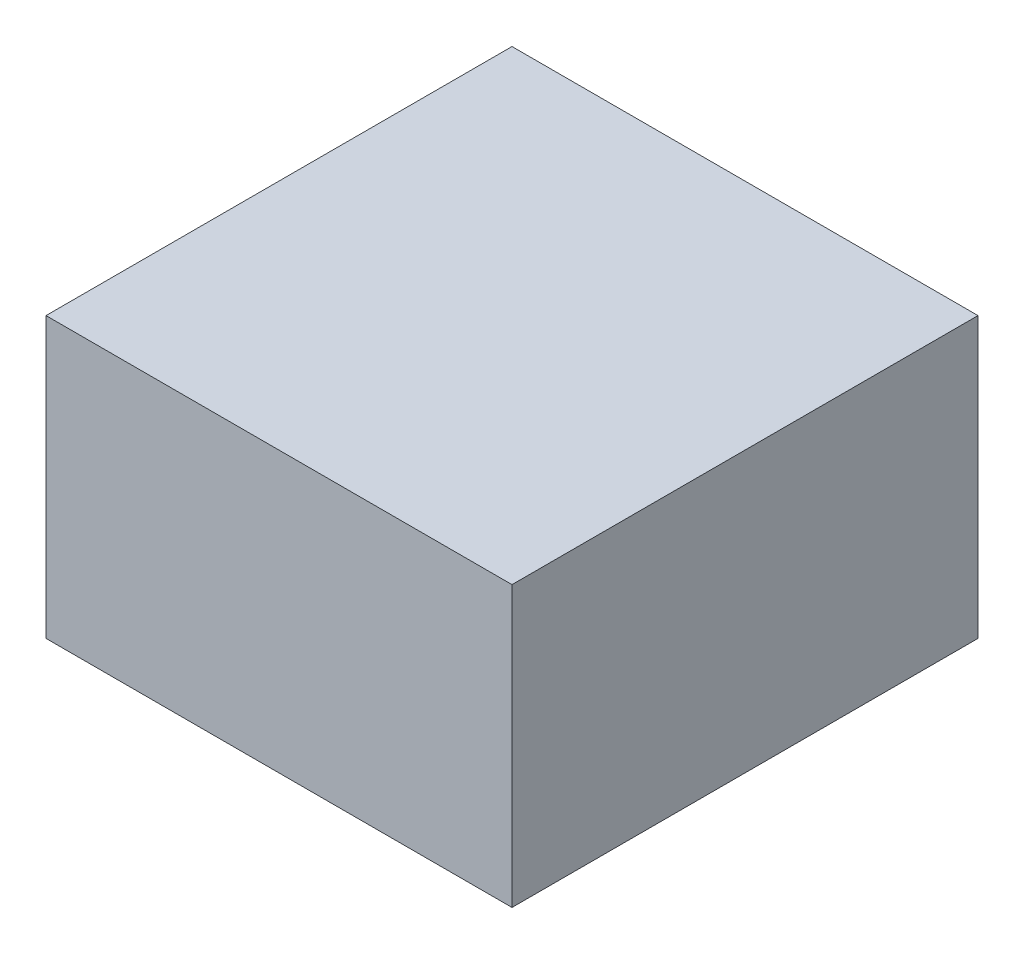
ISO-10303-21;
HEADER;
FILE_DESCRIPTION(('STEP AP214'),'2;1');
FILE_NAME('part.step','',(''),(''),'','','');
FILE_SCHEMA(('AUTOMOTIVE_DESIGN { 1 0 10303 214 1 1 1 1 }'));
ENDSEC;
DATA;
#1=APPLICATION_CONTEXT('core data for automotive mechanical design processes');
#2=APPLICATION_PROTOCOL_DEFINITION('international standard','automotive_design',2000,#1);
#3=PRODUCT_CONTEXT('',#1,'mechanical');
#4=PRODUCT('Part','Part','',(#3));
#5=PRODUCT_RELATED_PRODUCT_CATEGORY('part','',(#4));
#6=PRODUCT_DEFINITION_FORMATION('','',#4);
#7=PRODUCT_DEFINITION_CONTEXT('part definition',#1,'design');
#8=PRODUCT_DEFINITION('design','',#6,#7);
#9=PRODUCT_DEFINITION_SHAPE('','',#8);
#10=(LENGTH_UNIT() NAMED_UNIT(*) SI_UNIT(.MILLI.,.METRE.));
#11=(NAMED_UNIT(*) PLANE_ANGLE_UNIT() SI_UNIT($,.RADIAN.));
#12=(NAMED_UNIT(*) SI_UNIT($,.STERADIAN.) SOLID_ANGLE_UNIT());
#13=UNCERTAINTY_MEASURE_WITH_UNIT(LENGTH_MEASURE(1.E-05),#10,'distance_accuracy_value','');
#14=(GEOMETRIC_REPRESENTATION_CONTEXT(3) GLOBAL_UNCERTAINTY_ASSIGNED_CONTEXT((#13)) GLOBAL_UNIT_ASSIGNED_CONTEXT((#10,
#11,#12)) REPRESENTATION_CONTEXT('',''));
#15=CARTESIAN_POINT('',(0.,0.,0.));
#16=DIRECTION('',(0.,0.,1.));
#17=DIRECTION('',(1.,0.,0.));
#18=AXIS2_PLACEMENT_3D('',#15,#16,#17);
#19=CARTESIAN_POINT('',(31.75,38.1,31.75));
#20=DIRECTION('',(-1.,0.,0.));
#21=DIRECTION('',(0.,0.,1.));
#22=AXIS2_PLACEMENT_3D('',#19,#20,#21);
#23=PLANE('',#22);
#24=DIRECTION('',(0.,0.,-1.));
#25=VECTOR('',#24,1.);
#26=CARTESIAN_POINT('',(31.75,0.,31.75));
#27=LINE('',#26,#25);
#28=CARTESIAN_POINT('',(31.75,0.,31.75));
#29=VERTEX_POINT('',#28);
#30=CARTESIAN_POINT('',(31.75,0.,-31.75));
#31=VERTEX_POINT('',#30);
#32=EDGE_CURVE('E107',#29,#31,#27,.T.);
#33=ORIENTED_EDGE('',*,*,#32,.T.);
#34=DIRECTION('',(0.,-1.,0.));
#35=VECTOR('',#34,1.);
#36=CARTESIAN_POINT('',(31.75,38.1,-31.75));
#37=LINE('',#36,#35);
#38=CARTESIAN_POINT('',(31.75,38.1,-31.75));
#39=VERTEX_POINT('',#38);
#40=EDGE_CURVE('E11',#39,#31,#37,.T.);
#41=ORIENTED_EDGE('',*,*,#40,.F.);
#42=DIRECTION('',(0.,0.,-1.));
#43=VECTOR('',#42,1.);
#44=CARTESIAN_POINT('',(31.75,38.1,31.75));
#45=LINE('',#44,#43);
#46=CARTESIAN_POINT('',(31.75,38.1,31.75));
#47=VERTEX_POINT('',#46);
#48=EDGE_CURVE('E91',#47,#39,#45,.T.);
#49=ORIENTED_EDGE('',*,*,#48,.F.);
#50=DIRECTION('',(0.,-1.,0.));
#51=VECTOR('',#50,1.);
#52=CARTESIAN_POINT('',(31.75,38.1,31.75));
#53=LINE('',#52,#51);
#54=EDGE_CURVE('E103',#47,#29,#53,.T.);
#55=ORIENTED_EDGE('',*,*,#54,.T.);
#56=EDGE_LOOP('',(#33,#41,#49,#55));
#57=FACE_BOUND('',#56,.T.);
#58=ADVANCED_FACE('F39',(#57),#23,.F.);
#59=CARTESIAN_POINT('',(-31.75,38.1,-31.75));
#60=DIRECTION('',(0.,0.,1.));
#61=DIRECTION('',(1.,0.,0.));
#62=AXIS2_PLACEMENT_3D('',#59,#60,#61);
#63=PLANE('',#62);
#64=DIRECTION('',(-1.,0.,0.));
#65=VECTOR('',#64,1.);
#66=CARTESIAN_POINT('',(-31.75,0.,-31.75));
#67=LINE('',#66,#65);
#68=CARTESIAN_POINT('',(-31.75,0.,-31.75));
#69=VERTEX_POINT('',#68);
#70=EDGE_CURVE('E96',#31,#69,#67,.T.);
#71=ORIENTED_EDGE('',*,*,#70,.T.);
#72=DIRECTION('',(0.,-1.,0.));
#73=VECTOR('',#72,1.);
#74=CARTESIAN_POINT('',(-31.75,38.1,-31.75));
#75=LINE('',#74,#73);
#76=CARTESIAN_POINT('',(-31.75,38.1,-31.75));
#77=VERTEX_POINT('',#76);
#78=EDGE_CURVE('E48',#77,#69,#75,.T.);
#79=ORIENTED_EDGE('',*,*,#78,.F.);
#80=DIRECTION('',(-1.,0.,0.));
#81=VECTOR('',#80,1.);
#82=CARTESIAN_POINT('',(-31.75,38.1,-31.75));
#83=LINE('',#82,#81);
#84=EDGE_CURVE('E86',#39,#77,#83,.T.);
#85=ORIENTED_EDGE('',*,*,#84,.F.);
#86=ORIENTED_EDGE('',*,*,#40,.T.);
#87=EDGE_LOOP('',(#71,#79,#85,#86));
#88=FACE_BOUND('',#87,.T.);
#89=ADVANCED_FACE('F95',(#88),#63,.F.);
#90=CARTESIAN_POINT('',(-31.75,38.1,31.75));
#91=DIRECTION('',(1.,0.,0.));
#92=DIRECTION('',(0.,0.,-1.));
#93=AXIS2_PLACEMENT_3D('',#90,#91,#92);
#94=PLANE('',#93);
#95=DIRECTION('',(0.,0.,1.));
#96=VECTOR('',#95,1.);
#97=CARTESIAN_POINT('',(-31.75,0.,31.75));
#98=LINE('',#97,#96);
#99=CARTESIAN_POINT('',(-31.75,0.,31.75));
#100=VERTEX_POINT('',#99);
#101=EDGE_CURVE('E73',#69,#100,#98,.T.);
#102=ORIENTED_EDGE('',*,*,#101,.T.);
#103=DIRECTION('',(0.,-1.,0.));
#104=VECTOR('',#103,1.);
#105=CARTESIAN_POINT('',(-31.75,38.1,31.75));
#106=LINE('',#105,#104);
#107=CARTESIAN_POINT('',(-31.75,38.1,31.75));
#108=VERTEX_POINT('',#107);
#109=EDGE_CURVE('E98',#108,#100,#106,.T.);
#110=ORIENTED_EDGE('',*,*,#109,.F.);
#111=DIRECTION('',(0.,0.,1.));
#112=VECTOR('',#111,1.);
#113=CARTESIAN_POINT('',(-31.75,38.1,31.75));
#114=LINE('',#113,#112);
#115=EDGE_CURVE('E89',#77,#108,#114,.T.);
#116=ORIENTED_EDGE('',*,*,#115,.F.);
#117=ORIENTED_EDGE('',*,*,#78,.T.);
#118=EDGE_LOOP('',(#102,#110,#116,#117));
#119=FACE_BOUND('',#118,.T.);
#120=ADVANCED_FACE('F99',(#119),#94,.F.);
#121=CARTESIAN_POINT('',(-31.75,38.1,31.75));
#122=DIRECTION('',(0.,0.,-1.));
#123=DIRECTION('',(-1.,0.,0.));
#124=AXIS2_PLACEMENT_3D('',#121,#122,#123);
#125=PLANE('',#124);
#126=DIRECTION('',(1.,0.,0.));
#127=VECTOR('',#126,1.);
#128=CARTESIAN_POINT('',(-31.75,0.,31.75));
#129=LINE('',#128,#127);
#130=EDGE_CURVE('E79',#100,#29,#129,.T.);
#131=ORIENTED_EDGE('',*,*,#130,.T.);
#132=ORIENTED_EDGE('',*,*,#54,.F.);
#133=DIRECTION('',(1.,0.,0.));
#134=VECTOR('',#133,1.);
#135=CARTESIAN_POINT('',(-31.75,38.1,31.75));
#136=LINE('',#135,#134);
#137=EDGE_CURVE('E56',#108,#47,#136,.T.);
#138=ORIENTED_EDGE('',*,*,#137,.F.);
#139=ORIENTED_EDGE('',*,*,#109,.T.);
#140=EDGE_LOOP('',(#131,#132,#138,#139));
#141=FACE_BOUND('',#140,.T.);
#142=ADVANCED_FACE('F120',(#141),#125,.F.);
#143=CARTESIAN_POINT('',(0.,38.1,0.));
#144=DIRECTION('',(0.,-1.,0.));
#145=DIRECTION('',(0.,0.,-1.));
#146=AXIS2_PLACEMENT_3D('',#143,#144,#145);
#147=PLANE('',#146);
#148=ORIENTED_EDGE('',*,*,#48,.T.);
#149=ORIENTED_EDGE('',*,*,#84,.T.);
#150=ORIENTED_EDGE('',*,*,#115,.T.);
#151=ORIENTED_EDGE('',*,*,#137,.T.);
#152=EDGE_LOOP('',(#148,#149,#150,#151));
#153=FACE_BOUND('',#152,.T.);
#154=ADVANCED_FACE('F87',(#153),#147,.F.);
#155=CARTESIAN_POINT('',(0.,0.,0.));
#156=DIRECTION('',(0.,-1.,0.));
#157=DIRECTION('',(0.,0.,-1.));
#158=AXIS2_PLACEMENT_3D('',#155,#156,#157);
#159=PLANE('',#158);
#160=ORIENTED_EDGE('',*,*,#32,.F.);
#161=ORIENTED_EDGE('',*,*,#130,.F.);
#162=ORIENTED_EDGE('',*,*,#101,.F.);
#163=ORIENTED_EDGE('',*,*,#70,.F.);
#164=EDGE_LOOP('',(#160,#161,#162,#163));
#165=FACE_BOUND('',#164,.T.);
#166=ADVANCED_FACE('F123',(#165),#159,.T.);
#167=CLOSED_SHELL('',(#58,#89,#120,#142,#154,#166));
#168=MANIFOLD_SOLID_BREP('B2',#167);
#169=ADVANCED_BREP_SHAPE_REPRESENTATION('',(#18,#168),#14);
#170=SHAPE_DEFINITION_REPRESENTATION(#9,#169);
ENDSEC;
END-ISO-10303-21;
